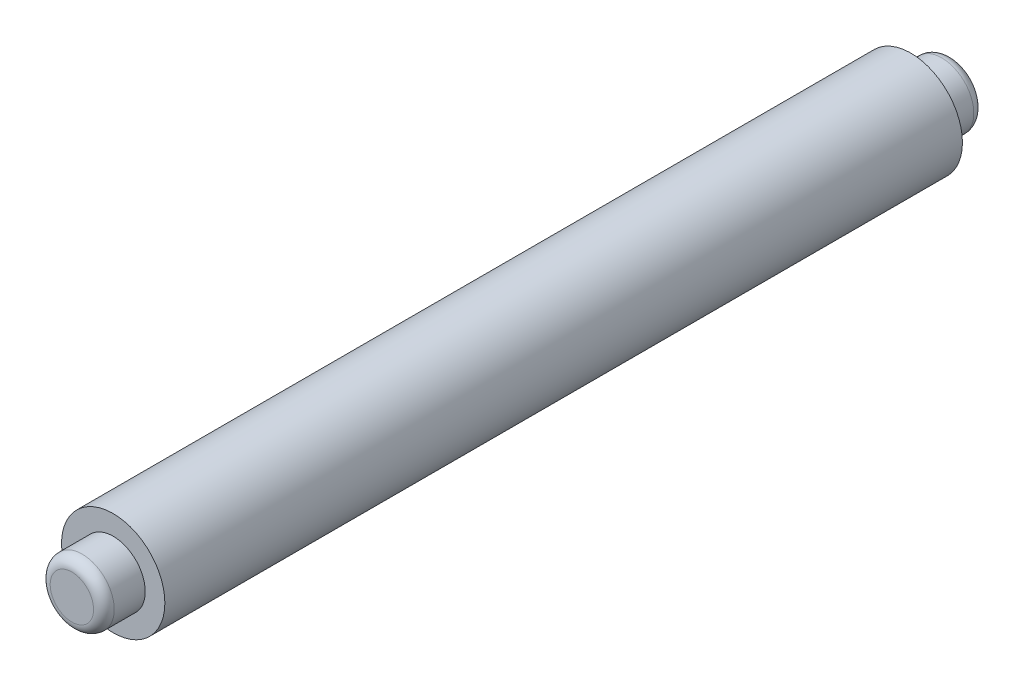
ISO-10303-21;
HEADER;
FILE_DESCRIPTION(('STEP AP214'),'2;1');
FILE_NAME('part.step','',(''),(''),'','','');
FILE_SCHEMA(('AUTOMOTIVE_DESIGN { 1 0 10303 214 1 1 1 1 }'));
ENDSEC;
DATA;
#1=APPLICATION_CONTEXT('core data for automotive mechanical design processes');
#2=APPLICATION_PROTOCOL_DEFINITION('international standard','automotive_design',2000,#1);
#3=PRODUCT_CONTEXT('',#1,'mechanical');
#4=PRODUCT('Part','Part','',(#3));
#5=PRODUCT_RELATED_PRODUCT_CATEGORY('part','',(#4));
#6=PRODUCT_DEFINITION_FORMATION('','',#4);
#7=PRODUCT_DEFINITION_CONTEXT('part definition',#1,'design');
#8=PRODUCT_DEFINITION('design','',#6,#7);
#9=PRODUCT_DEFINITION_SHAPE('','',#8);
#10=(LENGTH_UNIT() NAMED_UNIT(*) SI_UNIT(.MILLI.,.METRE.));
#11=(NAMED_UNIT(*) PLANE_ANGLE_UNIT() SI_UNIT($,.RADIAN.));
#12=(NAMED_UNIT(*) SI_UNIT($,.STERADIAN.) SOLID_ANGLE_UNIT());
#13=UNCERTAINTY_MEASURE_WITH_UNIT(LENGTH_MEASURE(1.E-05),#10,'distance_accuracy_value','');
#14=(GEOMETRIC_REPRESENTATION_CONTEXT(3) GLOBAL_UNCERTAINTY_ASSIGNED_CONTEXT((#13)) GLOBAL_UNIT_ASSIGNED_CONTEXT((#10,
#11,#12)) REPRESENTATION_CONTEXT('',''));
#15=CARTESIAN_POINT('',(0.,0.,0.));
#16=DIRECTION('',(0.,0.,1.));
#17=DIRECTION('',(1.,0.,0.));
#18=AXIS2_PLACEMENT_3D('',#15,#16,#17);
#19=CARTESIAN_POINT('',(-23.9727175118739,-13.5789119981316,38.61));
#20=DIRECTION('',(0.,0.,-1.));
#21=DIRECTION('',(-1.,0.,0.));
#22=AXIS2_PLACEMENT_3D('',#19,#20,#21);
#23=CYLINDRICAL_SURFACE('',#22,2.5);
#24=CARTESIAN_POINT('',(-23.9727175118739,-13.5789119981316,38.61));
#25=DIRECTION('',(0.,0.,1.));
#26=DIRECTION('',(1.,0.,0.));
#27=AXIS2_PLACEMENT_3D('',#24,#25,#26);
#28=CIRCLE('',#27,2.5);
#29=CARTESIAN_POINT('',(-21.4727175118739,-13.5789119981316,38.61));
#30=VERTEX_POINT('',#29);
#31=EDGE_CURVE('E60',#30,#30,#28,.T.);
#32=ORIENTED_EDGE('',*,*,#31,.F.);
#33=EDGE_LOOP('',(#32));
#34=FACE_BOUND('',#33,.T.);
#35=CARTESIAN_POINT('',(-23.9727175118739,-13.5789119981316,0.));
#36=DIRECTION('',(0.,0.,1.));
#37=DIRECTION('',(1.,0.,0.));
#38=AXIS2_PLACEMENT_3D('',#35,#36,#37);
#39=CIRCLE('',#38,2.5);
#40=CARTESIAN_POINT('',(-21.4727175118739,-13.5789119981316,0.));
#41=VERTEX_POINT('',#40);
#42=EDGE_CURVE('E57',#41,#41,#39,.T.);
#43=ORIENTED_EDGE('',*,*,#42,.T.);
#44=EDGE_LOOP('',(#43));
#45=FACE_BOUND('',#44,.T.);
#46=ADVANCED_FACE('F33',(#34,#45),#23,.T.);
#47=CARTESIAN_POINT('',(-23.9727175118739,-13.5789119981316,38.61));
#48=DIRECTION('',(0.,0.,1.));
#49=DIRECTION('',(1.,0.,0.));
#50=AXIS2_PLACEMENT_3D('',#47,#48,#49);
#51=PLANE('',#50);
#52=CARTESIAN_POINT('',(-23.9727175118739,-13.5789119981316,38.61));
#53=DIRECTION('',(0.,0.,1.));
#54=DIRECTION('',(1.,0.,0.));
#55=AXIS2_PLACEMENT_3D('',#52,#53,#54);
#56=CIRCLE('',#55,1.55);
#57=CARTESIAN_POINT('',(-22.4227175118739,-13.5789119981316,38.61));
#58=VERTEX_POINT('',#57);
#59=EDGE_CURVE('E56',#58,#58,#56,.T.);
#60=ORIENTED_EDGE('',*,*,#59,.F.);
#61=EDGE_LOOP('',(#60));
#62=FACE_BOUND('',#61,.T.);
#63=ORIENTED_EDGE('',*,*,#31,.T.);
#64=EDGE_LOOP('',(#63));
#65=FACE_BOUND('',#64,.T.);
#66=ADVANCED_FACE('F68',(#62,#65),#51,.T.);
#67=CARTESIAN_POINT('',(-23.9727175118739,-13.5789119981316,0.));
#68=DIRECTION('',(0.,0.,1.));
#69=DIRECTION('',(1.,0.,0.));
#70=AXIS2_PLACEMENT_3D('',#67,#68,#69);
#71=PLANE('',#70);
#72=CARTESIAN_POINT('',(-23.9727175118739,-13.5789119981316,0.));
#73=DIRECTION('',(0.,0.,-1.));
#74=DIRECTION('',(-1.,0.,0.));
#75=AXIS2_PLACEMENT_3D('',#72,#73,#74);
#76=CIRCLE('',#75,1.55);
#77=CARTESIAN_POINT('',(-25.5227175118739,-13.5789119981316,0.));
#78=VERTEX_POINT('',#77);
#79=EDGE_CURVE('E44',#78,#78,#76,.T.);
#80=ORIENTED_EDGE('',*,*,#79,.F.);
#81=EDGE_LOOP('',(#80));
#82=FACE_BOUND('',#81,.T.);
#83=ORIENTED_EDGE('',*,*,#42,.F.);
#84=EDGE_LOOP('',(#83));
#85=FACE_BOUND('',#84,.T.);
#86=ADVANCED_FACE('F71',(#82,#85),#71,.F.);
#87=CARTESIAN_POINT('',(-23.9727175118739,-13.5789119981316,40.61));
#88=DIRECTION('',(0.,0.,-1.));
#89=DIRECTION('',(-1.,0.,0.));
#90=AXIS2_PLACEMENT_3D('',#87,#88,#89);
#91=CYLINDRICAL_SURFACE('',#90,1.55);
#92=CARTESIAN_POINT('',(-23.9727175118739,-13.5789119981316,40.11));
#93=DIRECTION('',(0.,0.,1.));
#94=DIRECTION('',(1.,0.,0.));
#95=AXIS2_PLACEMENT_3D('',#92,#93,#94);
#96=CIRCLE('',#95,1.55);
#97=CARTESIAN_POINT('',(-22.4227175118739,-13.5789119981316,40.11));
#98=VERTEX_POINT('',#97);
#99=EDGE_CURVE('E48',#98,#98,#96,.F.);
#100=ORIENTED_EDGE('',*,*,#99,.T.);
#101=EDGE_LOOP('',(#100));
#102=FACE_BOUND('',#101,.T.);
#103=ORIENTED_EDGE('',*,*,#59,.T.);
#104=EDGE_LOOP('',(#103));
#105=FACE_BOUND('',#104,.T.);
#106=ADVANCED_FACE('F66',(#102,#105),#91,.T.);
#107=CARTESIAN_POINT('',(-23.9727175118739,-13.5789119981316,40.61));
#108=DIRECTION('',(0.,0.,1.));
#109=DIRECTION('',(1.,0.,0.));
#110=AXIS2_PLACEMENT_3D('',#107,#108,#109);
#111=PLANE('',#110);
#112=CARTESIAN_POINT('',(-23.9727175118739,-13.5789119981316,40.61));
#113=DIRECTION('',(0.,0.,1.));
#114=DIRECTION('',(1.,0.,0.));
#115=AXIS2_PLACEMENT_3D('',#112,#113,#114);
#116=CIRCLE('',#115,1.05);
#117=CARTESIAN_POINT('',(-22.9227175118739,-13.5789119981316,40.61));
#118=VERTEX_POINT('',#117);
#119=EDGE_CURVE('E53',#118,#118,#116,.T.);
#120=ORIENTED_EDGE('',*,*,#119,.T.);
#121=EDGE_LOOP('',(#120));
#122=FACE_BOUND('',#121,.T.);
#123=ADVANCED_FACE('F86',(#122),#111,.T.);
#124=CARTESIAN_POINT('',(-23.9727175118739,-13.5789119981316,40.11));
#125=DIRECTION('',(0.,0.,1.));
#126=DIRECTION('',(1.,0.,0.));
#127=AXIS2_PLACEMENT_3D('',#124,#125,#126);
#128=TOROIDAL_SURFACE('',#127,1.05,0.5);
#129=ORIENTED_EDGE('',*,*,#99,.F.);
#130=EDGE_LOOP('',(#129));
#131=FACE_BOUND('',#130,.T.);
#132=ORIENTED_EDGE('',*,*,#119,.F.);
#133=EDGE_LOOP('',(#132));
#134=FACE_BOUND('',#133,.T.);
#135=ADVANCED_FACE('F90',(#131,#134),#128,.T.);
#136=CARTESIAN_POINT('',(-23.9727175118739,-13.5789119981316,-2.));
#137=DIRECTION('',(0.,0.,1.));
#138=DIRECTION('',(1.,0.,0.));
#139=AXIS2_PLACEMENT_3D('',#136,#137,#138);
#140=CYLINDRICAL_SURFACE('',#139,1.55);
#141=CARTESIAN_POINT('',(-23.9727175118739,-13.5789119981316,-1.5));
#142=DIRECTION('',(0.,0.,-1.));
#143=DIRECTION('',(-1.,0.,0.));
#144=AXIS2_PLACEMENT_3D('',#141,#142,#143);
#145=CIRCLE('',#144,1.55);
#146=CARTESIAN_POINT('',(-25.5227175118739,-13.5789119981316,-1.5));
#147=VERTEX_POINT('',#146);
#148=EDGE_CURVE('E10',#147,#147,#145,.F.);
#149=ORIENTED_EDGE('',*,*,#148,.T.);
#150=EDGE_LOOP('',(#149));
#151=FACE_BOUND('',#150,.T.);
#152=ORIENTED_EDGE('',*,*,#79,.T.);
#153=EDGE_LOOP('',(#152));
#154=FACE_BOUND('',#153,.T.);
#155=ADVANCED_FACE('F92',(#151,#154),#140,.T.);
#156=CARTESIAN_POINT('',(-23.9727175118739,-13.5789119981316,-2.));
#157=DIRECTION('',(0.,0.,-1.));
#158=DIRECTION('',(-1.,0.,0.));
#159=AXIS2_PLACEMENT_3D('',#156,#157,#158);
#160=PLANE('',#159);
#161=CARTESIAN_POINT('',(-23.9727175118739,-13.5789119981316,-2.));
#162=DIRECTION('',(0.,0.,-1.));
#163=DIRECTION('',(-1.,0.,0.));
#164=AXIS2_PLACEMENT_3D('',#161,#162,#163);
#165=CIRCLE('',#164,1.05);
#166=CARTESIAN_POINT('',(-25.0227175118739,-13.5789119981316,-2.));
#167=VERTEX_POINT('',#166);
#168=EDGE_CURVE('E40',#167,#167,#165,.T.);
#169=ORIENTED_EDGE('',*,*,#168,.T.);
#170=EDGE_LOOP('',(#169));
#171=FACE_BOUND('',#170,.T.);
#172=ADVANCED_FACE('F98',(#171),#160,.T.);
#173=CARTESIAN_POINT('',(-23.9727175118739,-13.5789119981316,-1.5));
#174=DIRECTION('',(0.,0.,-1.));
#175=DIRECTION('',(-1.,0.,0.));
#176=AXIS2_PLACEMENT_3D('',#173,#174,#175);
#177=TOROIDAL_SURFACE('',#176,1.05,0.5);
#178=ORIENTED_EDGE('',*,*,#148,.F.);
#179=EDGE_LOOP('',(#178));
#180=FACE_BOUND('',#179,.T.);
#181=ORIENTED_EDGE('',*,*,#168,.F.);
#182=EDGE_LOOP('',(#181));
#183=FACE_BOUND('',#182,.T.);
#184=ADVANCED_FACE('F35',(#180,#183),#177,.T.);
#185=CLOSED_SHELL('',(#46,#66,#86,#106,#123,#135,#155,#172,#184));
#186=MANIFOLD_SOLID_BREP('B2',#185);
#187=ADVANCED_BREP_SHAPE_REPRESENTATION('',(#18,#186),#14);
#188=SHAPE_DEFINITION_REPRESENTATION(#9,#187);
ENDSEC;
END-ISO-10303-21;
